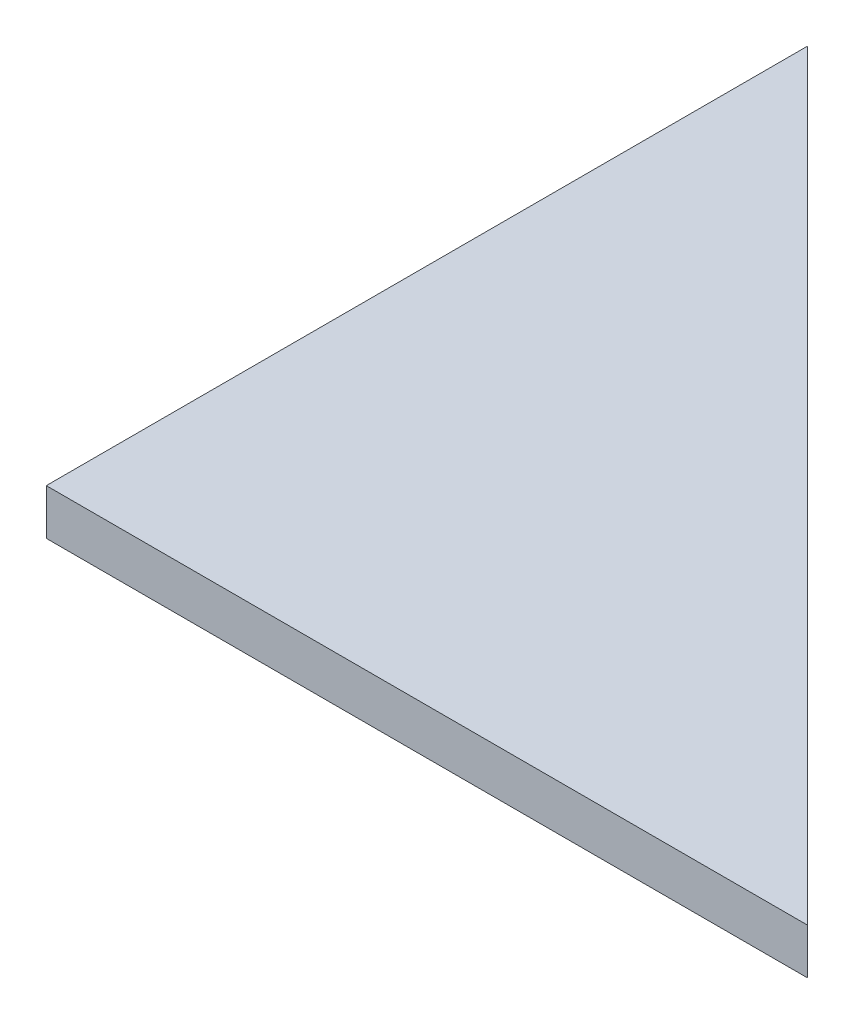
ISO-10303-21;
HEADER;
FILE_DESCRIPTION(('STEP AP214'),'2;1');
FILE_NAME('part.step','',(''),(''),'','','');
FILE_SCHEMA(('AUTOMOTIVE_DESIGN { 1 0 10303 214 1 1 1 1 }'));
ENDSEC;
DATA;
#1=APPLICATION_CONTEXT('core data for automotive mechanical design processes');
#2=APPLICATION_PROTOCOL_DEFINITION('international standard','automotive_design',2000,#1);
#3=PRODUCT_CONTEXT('',#1,'mechanical');
#4=PRODUCT('Part','Part','',(#3));
#5=PRODUCT_RELATED_PRODUCT_CATEGORY('part','',(#4));
#6=PRODUCT_DEFINITION_FORMATION('','',#4);
#7=PRODUCT_DEFINITION_CONTEXT('part definition',#1,'design');
#8=PRODUCT_DEFINITION('design','',#6,#7);
#9=PRODUCT_DEFINITION_SHAPE('','',#8);
#10=(LENGTH_UNIT() NAMED_UNIT(*) SI_UNIT(.MILLI.,.METRE.));
#11=(NAMED_UNIT(*) PLANE_ANGLE_UNIT() SI_UNIT($,.RADIAN.));
#12=(NAMED_UNIT(*) SI_UNIT($,.STERADIAN.) SOLID_ANGLE_UNIT());
#13=UNCERTAINTY_MEASURE_WITH_UNIT(LENGTH_MEASURE(1.E-05),#10,'distance_accuracy_value','');
#14=(GEOMETRIC_REPRESENTATION_CONTEXT(3) GLOBAL_UNCERTAINTY_ASSIGNED_CONTEXT((#13)) GLOBAL_UNIT_ASSIGNED_CONTEXT((#10,
#11,#12)) REPRESENTATION_CONTEXT('',''));
#15=CARTESIAN_POINT('',(0.,0.,0.));
#16=DIRECTION('',(0.,0.,1.));
#17=DIRECTION('',(1.,0.,0.));
#18=AXIS2_PLACEMENT_3D('',#15,#16,#17);
#19=CARTESIAN_POINT('',(0.,3.,0.));
#20=DIRECTION('',(-1.,0.,0.));
#21=DIRECTION('',(0.,0.,1.));
#22=AXIS2_PLACEMENT_3D('',#19,#20,#21);
#23=PLANE('',#22);
#24=DIRECTION('',(0.,0.,-1.));
#25=VECTOR('',#24,1.);
#26=CARTESIAN_POINT('',(0.,0.,0.));
#27=LINE('',#26,#25);
#28=CARTESIAN_POINT('',(0.,0.,0.));
#29=VERTEX_POINT('',#28);
#30=CARTESIAN_POINT('',(0.,0.,-50.));
#31=VERTEX_POINT('',#30);
#32=EDGE_CURVE('E77',#29,#31,#27,.T.);
#33=ORIENTED_EDGE('',*,*,#32,.F.);
#34=DIRECTION('',(0.,-1.,0.));
#35=VECTOR('',#34,1.);
#36=CARTESIAN_POINT('',(0.,3.,0.));
#37=LINE('',#36,#35);
#38=CARTESIAN_POINT('',(0.,3.,0.));
#39=VERTEX_POINT('',#38);
#40=EDGE_CURVE('E11',#39,#29,#37,.T.);
#41=ORIENTED_EDGE('',*,*,#40,.F.);
#42=DIRECTION('',(0.,0.,-1.));
#43=VECTOR('',#42,1.);
#44=CARTESIAN_POINT('',(0.,3.,0.));
#45=LINE('',#44,#43);
#46=CARTESIAN_POINT('',(0.,3.,-50.));
#47=VERTEX_POINT('',#46);
#48=EDGE_CURVE('E75',#39,#47,#45,.T.);
#49=ORIENTED_EDGE('',*,*,#48,.T.);
#50=DIRECTION('',(0.,-1.,0.));
#51=VECTOR('',#50,1.);
#52=CARTESIAN_POINT('',(0.,3.,-50.));
#53=LINE('',#52,#51);
#54=EDGE_CURVE('E57',#47,#31,#53,.T.);
#55=ORIENTED_EDGE('',*,*,#54,.T.);
#56=EDGE_LOOP('',(#33,#41,#49,#55));
#57=FACE_BOUND('',#56,.T.);
#58=ADVANCED_FACE('F41',(#57),#23,.T.);
#59=CARTESIAN_POINT('',(0.,3.,0.));
#60=DIRECTION('',(0.,0.,-1.));
#61=DIRECTION('',(-1.,0.,0.));
#62=AXIS2_PLACEMENT_3D('',#59,#60,#61);
#63=PLANE('',#62);
#64=DIRECTION('',(1.,0.,0.));
#65=VECTOR('',#64,1.);
#66=CARTESIAN_POINT('',(0.,0.,0.));
#67=LINE('',#66,#65);
#68=CARTESIAN_POINT('',(50.,0.,0.));
#69=VERTEX_POINT('',#68);
#70=EDGE_CURVE('E89',#29,#69,#67,.T.);
#71=ORIENTED_EDGE('',*,*,#70,.T.);
#72=DIRECTION('',(0.,-1.,0.));
#73=VECTOR('',#72,1.);
#74=CARTESIAN_POINT('',(50.,3.,0.));
#75=LINE('',#74,#73);
#76=CARTESIAN_POINT('',(50.,3.,0.));
#77=VERTEX_POINT('',#76);
#78=EDGE_CURVE('E49',#77,#69,#75,.T.);
#79=ORIENTED_EDGE('',*,*,#78,.F.);
#80=DIRECTION('',(1.,0.,0.));
#81=VECTOR('',#80,1.);
#82=CARTESIAN_POINT('',(0.,3.,0.));
#83=LINE('',#82,#81);
#84=EDGE_CURVE('E80',#39,#77,#83,.T.);
#85=ORIENTED_EDGE('',*,*,#84,.F.);
#86=ORIENTED_EDGE('',*,*,#40,.T.);
#87=EDGE_LOOP('',(#71,#79,#85,#86));
#88=FACE_BOUND('',#87,.T.);
#89=ADVANCED_FACE('F81',(#88),#63,.F.);
#90=CARTESIAN_POINT('',(25.,3.,-25.));
#91=DIRECTION('',(0.707106781186547,0.,-0.707106781186548));
#92=DIRECTION('',(-0.707106781186548,0.,-0.707106781186547));
#93=AXIS2_PLACEMENT_3D('',#90,#91,#92);
#94=PLANE('',#93);
#95=DIRECTION('',(0.707106781186548,0.,0.707106781186547));
#96=VECTOR('',#95,1.);
#97=CARTESIAN_POINT('',(25.,0.,-25.));
#98=LINE('',#97,#96);
#99=EDGE_CURVE('E86',#31,#69,#98,.T.);
#100=ORIENTED_EDGE('',*,*,#99,.F.);
#101=ORIENTED_EDGE('',*,*,#54,.F.);
#102=DIRECTION('',(0.707106781186548,0.,0.707106781186547));
#103=VECTOR('',#102,1.);
#104=CARTESIAN_POINT('',(25.,3.,-25.));
#105=LINE('',#104,#103);
#106=EDGE_CURVE('E83',#47,#77,#105,.T.);
#107=ORIENTED_EDGE('',*,*,#106,.T.);
#108=ORIENTED_EDGE('',*,*,#78,.T.);
#109=EDGE_LOOP('',(#100,#101,#107,#108));
#110=FACE_BOUND('',#109,.T.);
#111=ADVANCED_FACE('F97',(#110),#94,.T.);
#112=CARTESIAN_POINT('',(0.,3.,0.));
#113=DIRECTION('',(0.,1.,0.));
#114=DIRECTION('',(0.,0.,1.));
#115=AXIS2_PLACEMENT_3D('',#112,#113,#114);
#116=PLANE('',#115);
#117=ORIENTED_EDGE('',*,*,#48,.F.);
#118=ORIENTED_EDGE('',*,*,#84,.T.);
#119=ORIENTED_EDGE('',*,*,#106,.F.);
#120=EDGE_LOOP('',(#117,#118,#119));
#121=FACE_BOUND('',#120,.T.);
#122=ADVANCED_FACE('F85',(#121),#116,.T.);
#123=CARTESIAN_POINT('',(0.,0.,0.));
#124=DIRECTION('',(0.,1.,0.));
#125=DIRECTION('',(0.,0.,1.));
#126=AXIS2_PLACEMENT_3D('',#123,#124,#125);
#127=PLANE('',#126);
#128=ORIENTED_EDGE('',*,*,#32,.T.);
#129=ORIENTED_EDGE('',*,*,#99,.T.);
#130=ORIENTED_EDGE('',*,*,#70,.F.);
#131=EDGE_LOOP('',(#128,#129,#130));
#132=FACE_BOUND('',#131,.T.);
#133=ADVANCED_FACE('F96',(#132),#127,.F.);
#134=CLOSED_SHELL('',(#58,#89,#111,#122,#133));
#135=MANIFOLD_SOLID_BREP('B2',#134);
#136=ADVANCED_BREP_SHAPE_REPRESENTATION('',(#18,#135),#14);
#137=SHAPE_DEFINITION_REPRESENTATION(#9,#136);
ENDSEC;
END-ISO-10303-21;
